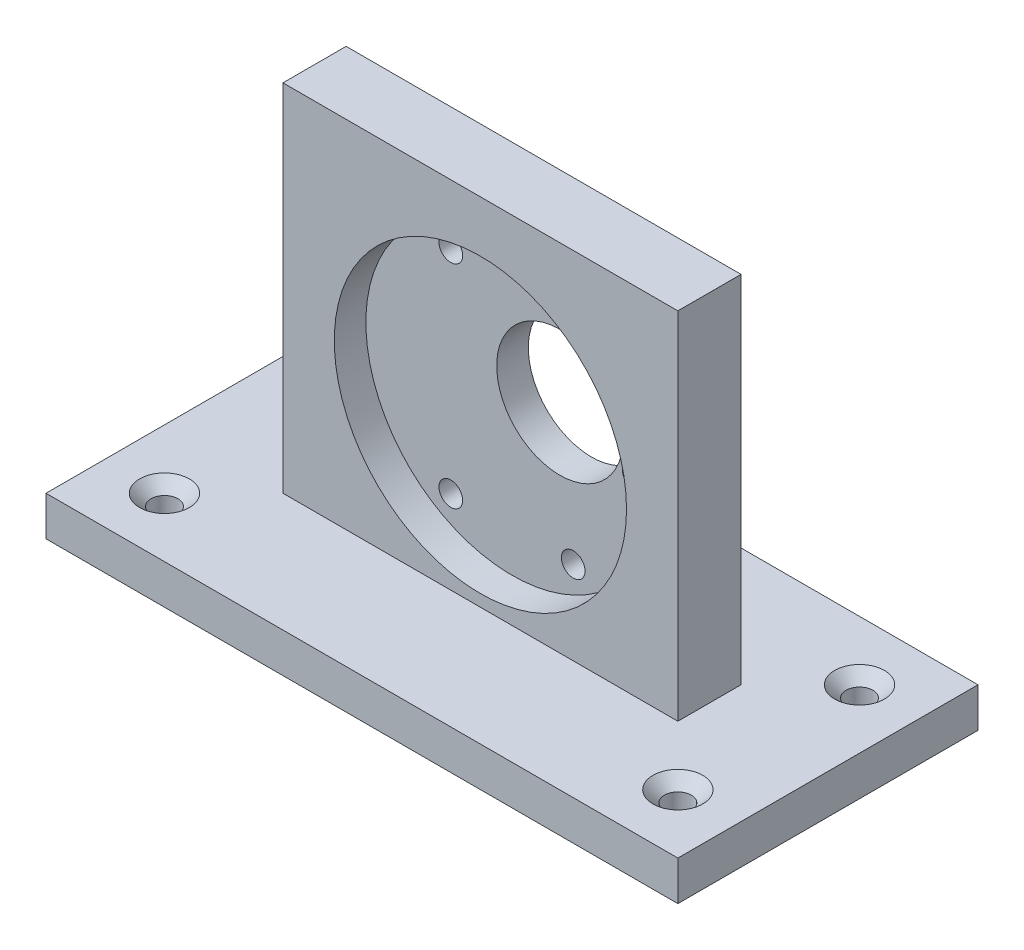
ISO-10303-21;
HEADER;
FILE_DESCRIPTION(('STEP AP214'),'2;1');
FILE_NAME('part.step','',(''),(''),'','','');
FILE_SCHEMA(('AUTOMOTIVE_DESIGN { 1 0 10303 214 1 1 1 1 }'));
ENDSEC;
DATA;
#1=APPLICATION_CONTEXT('core data for automotive mechanical design processes');
#2=APPLICATION_PROTOCOL_DEFINITION('international standard','automotive_design',2000,#1);
#3=PRODUCT_CONTEXT('',#1,'mechanical');
#4=PRODUCT('Part','Part','',(#3));
#5=PRODUCT_RELATED_PRODUCT_CATEGORY('part','',(#4));
#6=PRODUCT_DEFINITION_FORMATION('','',#4);
#7=PRODUCT_DEFINITION_CONTEXT('part definition',#1,'design');
#8=PRODUCT_DEFINITION('design','',#6,#7);
#9=PRODUCT_DEFINITION_SHAPE('','',#8);
#10=(LENGTH_UNIT() NAMED_UNIT(*) SI_UNIT(.MILLI.,.METRE.));
#11=(NAMED_UNIT(*) PLANE_ANGLE_UNIT() SI_UNIT($,.RADIAN.));
#12=(NAMED_UNIT(*) SI_UNIT($,.STERADIAN.) SOLID_ANGLE_UNIT());
#13=UNCERTAINTY_MEASURE_WITH_UNIT(LENGTH_MEASURE(1.E-05),#10,'distance_accuracy_value','');
#14=(GEOMETRIC_REPRESENTATION_CONTEXT(3) GLOBAL_UNCERTAINTY_ASSIGNED_CONTEXT((#13)) GLOBAL_UNIT_ASSIGNED_CONTEXT((#10,
#11,#12)) REPRESENTATION_CONTEXT('',''));
#15=CARTESIAN_POINT('',(0.,0.,0.));
#16=DIRECTION('',(0.,0.,1.));
#17=DIRECTION('',(1.,0.,0.));
#18=AXIS2_PLACEMENT_3D('',#15,#16,#17);
#19=CARTESIAN_POINT('',(-25.,50.,8.));
#20=DIRECTION('',(1.,0.,0.));
#21=DIRECTION('',(0.,1.,0.));
#22=AXIS2_PLACEMENT_3D('',#19,#20,#21);
#23=PLANE('',#22);
#24=DIRECTION('',(0.,0.,-1.));
#25=VECTOR('',#24,1.);
#26=CARTESIAN_POINT('',(-25.,5.,8.));
#27=LINE('',#26,#25);
#28=CARTESIAN_POINT('',(-25.,5.,8.));
#29=VERTEX_POINT('',#28);
#30=CARTESIAN_POINT('',(-25.,5.,0.));
#31=VERTEX_POINT('',#30);
#32=EDGE_CURVE('E60',#29,#31,#27,.T.);
#33=ORIENTED_EDGE('',*,*,#32,.F.);
#34=DIRECTION('',(0.,-1.,0.));
#35=VECTOR('',#34,1.);
#36=CARTESIAN_POINT('',(-25.,50.,8.));
#37=LINE('',#36,#35);
#38=CARTESIAN_POINT('',(-25.,50.,8.));
#39=VERTEX_POINT('',#38);
#40=EDGE_CURVE('E84',#39,#29,#37,.T.);
#41=ORIENTED_EDGE('',*,*,#40,.F.);
#42=DIRECTION('',(0.,0.,-1.));
#43=VECTOR('',#42,1.);
#44=CARTESIAN_POINT('',(-25.,50.,8.));
#45=LINE('',#44,#43);
#46=CARTESIAN_POINT('',(-25.,50.,0.));
#47=VERTEX_POINT('',#46);
#48=EDGE_CURVE('E69',#39,#47,#45,.T.);
#49=ORIENTED_EDGE('',*,*,#48,.T.);
#50=DIRECTION('',(0.,-1.,0.));
#51=VECTOR('',#50,1.);
#52=CARTESIAN_POINT('',(-25.,50.,0.));
#53=LINE('',#52,#51);
#54=EDGE_CURVE('E82',#47,#31,#53,.T.);
#55=ORIENTED_EDGE('',*,*,#54,.T.);
#56=EDGE_LOOP('',(#33,#41,#49,#55));
#57=FACE_BOUND('',#56,.T.);
#58=ADVANCED_FACE('F45',(#57),#23,.F.);
#59=CARTESIAN_POINT('',(25.,50.,8.));
#60=DIRECTION('',(1.,0.,0.));
#61=DIRECTION('',(0.,1.,0.));
#62=AXIS2_PLACEMENT_3D('',#59,#60,#61);
#63=PLANE('',#62);
#64=DIRECTION('',(0.,-1.,0.));
#65=VECTOR('',#64,1.);
#66=CARTESIAN_POINT('',(25.,50.,8.));
#67=LINE('',#66,#65);
#68=CARTESIAN_POINT('',(25.,50.,8.));
#69=VERTEX_POINT('',#68);
#70=CARTESIAN_POINT('',(25.,5.00000000000001,8.));
#71=VERTEX_POINT('',#70);
#72=EDGE_CURVE('E152',#69,#71,#67,.T.);
#73=ORIENTED_EDGE('',*,*,#72,.T.);
#74=DIRECTION('',(0.,0.,-1.));
#75=VECTOR('',#74,1.);
#76=CARTESIAN_POINT('',(25.,5.00000000000001,8.));
#77=LINE('',#76,#75);
#78=CARTESIAN_POINT('',(25.,5.00000000000001,0.));
#79=VERTEX_POINT('',#78);
#80=EDGE_CURVE('E202',#71,#79,#77,.T.);
#81=ORIENTED_EDGE('',*,*,#80,.T.);
#82=DIRECTION('',(0.,-1.,0.));
#83=VECTOR('',#82,1.);
#84=CARTESIAN_POINT('',(25.,50.,0.));
#85=LINE('',#84,#83);
#86=CARTESIAN_POINT('',(25.,50.,0.));
#87=VERTEX_POINT('',#86);
#88=EDGE_CURVE('E94',#87,#79,#85,.T.);
#89=ORIENTED_EDGE('',*,*,#88,.F.);
#90=DIRECTION('',(0.,0.,-1.));
#91=VECTOR('',#90,1.);
#92=CARTESIAN_POINT('',(25.,50.,8.));
#93=LINE('',#92,#91);
#94=EDGE_CURVE('E86',#69,#87,#93,.T.);
#95=ORIENTED_EDGE('',*,*,#94,.F.);
#96=EDGE_LOOP('',(#73,#81,#89,#95));
#97=FACE_BOUND('',#96,.T.);
#98=ADVANCED_FACE('F239',(#97),#63,.T.);
#99=CARTESIAN_POINT('',(0.,0.,8.));
#100=DIRECTION('',(0.,0.,-1.));
#101=DIRECTION('',(-1.,0.,0.));
#102=AXIS2_PLACEMENT_3D('',#99,#100,#101);
#103=PLANE('',#102);
#104=CARTESIAN_POINT('',(0.,25.,8.));
#105=DIRECTION('',(0.,0.,1.));
#106=DIRECTION('',(1.,0.,0.));
#107=AXIS2_PLACEMENT_3D('',#104,#105,#106);
#108=CIRCLE('',#107,18.5);
#109=CARTESIAN_POINT('',(18.5,25.,8.));
#110=VERTEX_POINT('',#109);
#111=EDGE_CURVE('E117',#110,#110,#108,.T.);
#112=ORIENTED_EDGE('',*,*,#111,.F.);
#113=EDGE_LOOP('',(#112));
#114=FACE_BOUND('',#113,.T.);
#115=DIRECTION('',(-1.,0.,0.));
#116=VECTOR('',#115,1.);
#117=CARTESIAN_POINT('',(0.,5.00000000000001,8.));
#118=LINE('',#117,#116);
#119=EDGE_CURVE('E122',#71,#29,#118,.T.);
#120=ORIENTED_EDGE('',*,*,#119,.F.);
#121=ORIENTED_EDGE('',*,*,#72,.F.);
#122=DIRECTION('',(1.,0.,0.));
#123=VECTOR('',#122,1.);
#124=CARTESIAN_POINT('',(-25.,50.,8.));
#125=LINE('',#124,#123);
#126=EDGE_CURVE('E93',#39,#69,#125,.T.);
#127=ORIENTED_EDGE('',*,*,#126,.F.);
#128=ORIENTED_EDGE('',*,*,#40,.T.);
#129=EDGE_LOOP('',(#120,#121,#127,#128));
#130=FACE_BOUND('',#129,.T.);
#131=ADVANCED_FACE('F160',(#114,#130),#103,.F.);
#132=CARTESIAN_POINT('',(0.,0.,0.));
#133=DIRECTION('',(0.,0.,-1.));
#134=DIRECTION('',(-1.,0.,0.));
#135=AXIS2_PLACEMENT_3D('',#132,#133,#134);
#136=PLANE('',#135);
#137=CARTESIAN_POINT('',(-17.9178221746704,28.4999999993294,0.));
#138=DIRECTION('',(0.,0.,-1.));
#139=DIRECTION('',(-1.,0.,0.));
#140=AXIS2_PLACEMENT_3D('',#137,#138,#139);
#141=CIRCLE('',#140,6.207);
#142=CARTESIAN_POINT('',(-24.1248221746704,28.4999999993294,0.));
#143=VERTEX_POINT('',#142);
#144=EDGE_CURVE('E321',#143,#143,#141,.T.);
#145=ORIENTED_EDGE('',*,*,#144,.F.);
#146=EDGE_LOOP('',(#145));
#147=FACE_BOUND('',#146,.T.);
#148=CARTESIAN_POINT('',(-7.74999999999999,38.4233937586588,0.));
#149=DIRECTION('',(0.,0.,1.));
#150=DIRECTION('',(1.,0.,0.));
#151=AXIS2_PLACEMENT_3D('',#148,#149,#150);
#152=CIRCLE('',#151,1.50000000039213);
#153=CARTESIAN_POINT('',(-6.24999999960786,38.4233937586588,0.));
#154=VERTEX_POINT('',#153);
#155=EDGE_CURVE('E101',#154,#154,#152,.T.);
#156=ORIENTED_EDGE('',*,*,#155,.T.);
#157=EDGE_LOOP('',(#156));
#158=FACE_BOUND('',#157,.T.);
#159=CARTESIAN_POINT('',(-7.74999999999999,11.5766062413412,0.));
#160=DIRECTION('',(0.,0.,1.));
#161=DIRECTION('',(1.,0.,0.));
#162=AXIS2_PLACEMENT_3D('',#159,#160,#161);
#163=CIRCLE('',#162,1.50000000039213);
#164=CARTESIAN_POINT('',(-6.24999999960786,11.5766062413412,0.));
#165=VERTEX_POINT('',#164);
#166=EDGE_CURVE('E144',#165,#165,#163,.T.);
#167=ORIENTED_EDGE('',*,*,#166,.T.);
#168=EDGE_LOOP('',(#167));
#169=FACE_BOUND('',#168,.T.);
#170=CARTESIAN_POINT('',(7.75000000000001,11.5766062413412,0.));
#171=DIRECTION('',(0.,0.,1.));
#172=DIRECTION('',(1.,0.,0.));
#173=AXIS2_PLACEMENT_3D('',#170,#171,#172);
#174=CIRCLE('',#173,1.50000000039213);
#175=CARTESIAN_POINT('',(9.25000000039214,11.5766062413412,0.));
#176=VERTEX_POINT('',#175);
#177=EDGE_CURVE('E147',#176,#176,#174,.T.);
#178=ORIENTED_EDGE('',*,*,#177,.T.);
#179=EDGE_LOOP('',(#178));
#180=FACE_BOUND('',#179,.T.);
#181=CARTESIAN_POINT('',(15.5,25.,0.));
#182=DIRECTION('',(0.,0.,1.));
#183=DIRECTION('',(1.,0.,0.));
#184=AXIS2_PLACEMENT_3D('',#181,#182,#183);
#185=CIRCLE('',#184,1.50000000039213);
#186=CARTESIAN_POINT('',(17.0000000003921,25.,0.));
#187=VERTEX_POINT('',#186);
#188=EDGE_CURVE('E141',#187,#187,#185,.T.);
#189=ORIENTED_EDGE('',*,*,#188,.T.);
#190=EDGE_LOOP('',(#189));
#191=FACE_BOUND('',#190,.T.);
#192=CARTESIAN_POINT('',(6.06217782532956,28.4999999993294,0.));
#193=DIRECTION('',(0.,0.,1.));
#194=DIRECTION('',(1.,0.,0.));
#195=AXIS2_PLACEMENT_3D('',#192,#193,#194);
#196=CIRCLE('',#195,8.00000000000001);
#197=CARTESIAN_POINT('',(14.0621778253296,28.4999999993294,0.));
#198=VERTEX_POINT('',#197);
#199=EDGE_CURVE('E138',#198,#198,#196,.T.);
#200=ORIENTED_EDGE('',*,*,#199,.T.);
#201=EDGE_LOOP('',(#200));
#202=FACE_BOUND('',#201,.T.);
#203=CARTESIAN_POINT('',(7.74999999999999,38.4233937586588,0.));
#204=DIRECTION('',(0.,0.,1.));
#205=DIRECTION('',(1.,0.,0.));
#206=AXIS2_PLACEMENT_3D('',#203,#204,#205);
#207=CIRCLE('',#206,1.50000000039214);
#208=CARTESIAN_POINT('',(9.25000000039213,38.4233937586588,0.));
#209=VERTEX_POINT('',#208);
#210=EDGE_CURVE('E97',#209,#209,#207,.T.);
#211=ORIENTED_EDGE('',*,*,#210,.T.);
#212=EDGE_LOOP('',(#211));
#213=FACE_BOUND('',#212,.T.);
#214=ORIENTED_EDGE('',*,*,#88,.T.);
#215=DIRECTION('',(-1.,0.,0.));
#216=VECTOR('',#215,1.);
#217=CARTESIAN_POINT('',(0.,5.00000000000001,0.));
#218=LINE('',#217,#216);
#219=EDGE_CURVE('E53',#79,#31,#218,.T.);
#220=ORIENTED_EDGE('',*,*,#219,.T.);
#221=ORIENTED_EDGE('',*,*,#54,.F.);
#222=DIRECTION('',(1.,0.,0.));
#223=VECTOR('',#222,1.);
#224=CARTESIAN_POINT('',(-25.,50.,0.));
#225=LINE('',#224,#223);
#226=EDGE_CURVE('E92',#47,#87,#225,.T.);
#227=ORIENTED_EDGE('',*,*,#226,.T.);
#228=EDGE_LOOP('',(#214,#220,#221,#227));
#229=FACE_BOUND('',#228,.T.);
#230=ADVANCED_FACE('F91',(#147,#158,#169,#180,#191,#202,#213,#229),#136,.T.);
#231=CARTESIAN_POINT('',(7.74999999999999,38.4233937586588,10.));
#232=DIRECTION('',(0.,0.,-1.));
#233=DIRECTION('',(-1.,0.,0.));
#234=AXIS2_PLACEMENT_3D('',#231,#232,#233);
#235=CYLINDRICAL_SURFACE('',#234,1.50000000039214);
#236=ORIENTED_EDGE('',*,*,#210,.F.);
#237=EDGE_LOOP('',(#236));
#238=FACE_BOUND('',#237,.T.);
#239=CARTESIAN_POINT('',(7.74999999999999,38.4233937586588,4.));
#240=DIRECTION('',(0.,0.,1.));
#241=DIRECTION('',(1.,0.,0.));
#242=AXIS2_PLACEMENT_3D('',#239,#240,#241);
#243=CIRCLE('',#242,1.50000000039214);
#244=CARTESIAN_POINT('',(9.25000000039213,38.4233937586588,4.));
#245=VERTEX_POINT('',#244);
#246=EDGE_CURVE('E135',#245,#245,#243,.T.);
#247=ORIENTED_EDGE('',*,*,#246,.T.);
#248=EDGE_LOOP('',(#247));
#249=FACE_BOUND('',#248,.T.);
#250=ADVANCED_FACE('F390',(#238,#249),#235,.F.);
#251=CARTESIAN_POINT('',(6.06217782532956,28.4999999993294,10.));
#252=DIRECTION('',(0.,0.,-1.));
#253=DIRECTION('',(-1.,0.,0.));
#254=AXIS2_PLACEMENT_3D('',#251,#252,#253);
#255=CYLINDRICAL_SURFACE('',#254,8.00000000000001);
#256=ORIENTED_EDGE('',*,*,#199,.F.);
#257=EDGE_LOOP('',(#256));
#258=FACE_BOUND('',#257,.T.);
#259=CARTESIAN_POINT('',(6.06217782532956,28.4999999993294,4.));
#260=DIRECTION('',(0.,0.,1.));
#261=DIRECTION('',(1.,0.,0.));
#262=AXIS2_PLACEMENT_3D('',#259,#260,#261);
#263=CIRCLE('',#262,8.00000000000001);
#264=CARTESIAN_POINT('',(14.0621778253296,28.4999999993294,4.));
#265=VERTEX_POINT('',#264);
#266=EDGE_CURVE('E132',#265,#265,#263,.T.);
#267=ORIENTED_EDGE('',*,*,#266,.T.);
#268=EDGE_LOOP('',(#267));
#269=FACE_BOUND('',#268,.T.);
#270=ADVANCED_FACE('F386',(#258,#269),#255,.F.);
#271=CARTESIAN_POINT('',(15.5,25.,10.));
#272=DIRECTION('',(0.,0.,-1.));
#273=DIRECTION('',(-1.,0.,0.));
#274=AXIS2_PLACEMENT_3D('',#271,#272,#273);
#275=CYLINDRICAL_SURFACE('',#274,1.50000000039213);
#276=ORIENTED_EDGE('',*,*,#188,.F.);
#277=EDGE_LOOP('',(#276));
#278=FACE_BOUND('',#277,.T.);
#279=CARTESIAN_POINT('',(15.5,25.,4.));
#280=DIRECTION('',(0.,0.,1.));
#281=DIRECTION('',(1.,0.,0.));
#282=AXIS2_PLACEMENT_3D('',#279,#280,#281);
#283=CIRCLE('',#282,1.50000000039213);
#284=CARTESIAN_POINT('',(17.0000000003921,25.,4.));
#285=VERTEX_POINT('',#284);
#286=EDGE_CURVE('E129',#285,#285,#283,.T.);
#287=ORIENTED_EDGE('',*,*,#286,.T.);
#288=EDGE_LOOP('',(#287));
#289=FACE_BOUND('',#288,.T.);
#290=ADVANCED_FACE('F389',(#278,#289),#275,.F.);
#291=CARTESIAN_POINT('',(7.75000000000001,11.5766062413412,10.));
#292=DIRECTION('',(0.,0.,-1.));
#293=DIRECTION('',(-1.,0.,0.));
#294=AXIS2_PLACEMENT_3D('',#291,#292,#293);
#295=CYLINDRICAL_SURFACE('',#294,1.50000000039213);
#296=ORIENTED_EDGE('',*,*,#177,.F.);
#297=EDGE_LOOP('',(#296));
#298=FACE_BOUND('',#297,.T.);
#299=CARTESIAN_POINT('',(7.75000000000001,11.5766062413412,4.));
#300=DIRECTION('',(0.,0.,1.));
#301=DIRECTION('',(1.,0.,0.));
#302=AXIS2_PLACEMENT_3D('',#299,#300,#301);
#303=CIRCLE('',#302,1.50000000039213);
#304=CARTESIAN_POINT('',(9.25000000039214,11.5766062413412,4.));
#305=VERTEX_POINT('',#304);
#306=EDGE_CURVE('E114',#305,#305,#303,.T.);
#307=ORIENTED_EDGE('',*,*,#306,.T.);
#308=EDGE_LOOP('',(#307));
#309=FACE_BOUND('',#308,.T.);
#310=ADVANCED_FACE('F399',(#298,#309),#295,.F.);
#311=CARTESIAN_POINT('',(-7.74999999999999,11.5766062413412,10.));
#312=DIRECTION('',(0.,0.,-1.));
#313=DIRECTION('',(-1.,0.,0.));
#314=AXIS2_PLACEMENT_3D('',#311,#312,#313);
#315=CYLINDRICAL_SURFACE('',#314,1.50000000039213);
#316=ORIENTED_EDGE('',*,*,#166,.F.);
#317=EDGE_LOOP('',(#316));
#318=FACE_BOUND('',#317,.T.);
#319=CARTESIAN_POINT('',(-7.74999999999999,11.5766062413412,4.));
#320=DIRECTION('',(0.,0.,1.));
#321=DIRECTION('',(1.,0.,0.));
#322=AXIS2_PLACEMENT_3D('',#319,#320,#321);
#323=CIRCLE('',#322,1.50000000039213);
#324=CARTESIAN_POINT('',(-6.24999999960786,11.5766062413412,4.));
#325=VERTEX_POINT('',#324);
#326=EDGE_CURVE('E109',#325,#325,#323,.T.);
#327=ORIENTED_EDGE('',*,*,#326,.T.);
#328=EDGE_LOOP('',(#327));
#329=FACE_BOUND('',#328,.T.);
#330=ADVANCED_FACE('F395',(#318,#329),#315,.F.);
#331=CARTESIAN_POINT('',(-7.74999999999999,38.4233937586588,10.));
#332=DIRECTION('',(0.,0.,-1.));
#333=DIRECTION('',(-1.,0.,0.));
#334=AXIS2_PLACEMENT_3D('',#331,#332,#333);
#335=CYLINDRICAL_SURFACE('',#334,1.50000000039213);
#336=ORIENTED_EDGE('',*,*,#155,.F.);
#337=EDGE_LOOP('',(#336));
#338=FACE_BOUND('',#337,.T.);
#339=CARTESIAN_POINT('',(-7.74999999999999,38.4233937586588,4.));
#340=DIRECTION('',(0.,0.,1.));
#341=DIRECTION('',(1.,0.,0.));
#342=AXIS2_PLACEMENT_3D('',#339,#340,#341);
#343=CIRCLE('',#342,1.50000000039213);
#344=CARTESIAN_POINT('',(-6.24999999960786,38.4233937586588,4.));
#345=VERTEX_POINT('',#344);
#346=EDGE_CURVE('E107',#345,#345,#343,.T.);
#347=ORIENTED_EDGE('',*,*,#346,.T.);
#348=EDGE_LOOP('',(#347));
#349=FACE_BOUND('',#348,.T.);
#350=ADVANCED_FACE('F392',(#338,#349),#335,.F.);
#351=CARTESIAN_POINT('',(-25.,50.,8.));
#352=DIRECTION('',(0.,1.,0.));
#353=DIRECTION('',(-1.,0.,0.));
#354=AXIS2_PLACEMENT_3D('',#351,#352,#353);
#355=PLANE('',#354);
#356=ORIENTED_EDGE('',*,*,#226,.F.);
#357=ORIENTED_EDGE('',*,*,#48,.F.);
#358=ORIENTED_EDGE('',*,*,#126,.T.);
#359=ORIENTED_EDGE('',*,*,#94,.T.);
#360=EDGE_LOOP('',(#356,#357,#358,#359));
#361=FACE_BOUND('',#360,.T.);
#362=ADVANCED_FACE('F47',(#361),#355,.T.);
#363=CARTESIAN_POINT('',(0.,25.,4.));
#364=DIRECTION('',(0.,0.,1.));
#365=DIRECTION('',(1.,0.,0.));
#366=AXIS2_PLACEMENT_3D('',#363,#364,#365);
#367=CYLINDRICAL_SURFACE('',#366,18.5);
#368=CARTESIAN_POINT('',(0.,25.,4.));
#369=DIRECTION('',(0.,0.,1.));
#370=DIRECTION('',(1.,0.,0.));
#371=AXIS2_PLACEMENT_3D('',#368,#369,#370);
#372=CIRCLE('',#371,18.5);
#373=CARTESIAN_POINT('',(18.5,25.,4.));
#374=VERTEX_POINT('',#373);
#375=EDGE_CURVE('E110',#374,#374,#372,.T.);
#376=ORIENTED_EDGE('',*,*,#375,.F.);
#377=EDGE_LOOP('',(#376));
#378=FACE_BOUND('',#377,.T.);
#379=ORIENTED_EDGE('',*,*,#111,.T.);
#380=EDGE_LOOP('',(#379));
#381=FACE_BOUND('',#380,.T.);
#382=ADVANCED_FACE('F251',(#378,#381),#367,.F.);
#383=CARTESIAN_POINT('',(0.,25.,4.));
#384=DIRECTION('',(0.,0.,1.));
#385=DIRECTION('',(1.,0.,0.));
#386=AXIS2_PLACEMENT_3D('',#383,#384,#385);
#387=PLANE('',#386);
#388=ORIENTED_EDGE('',*,*,#246,.F.);
#389=EDGE_LOOP('',(#388));
#390=FACE_BOUND('',#389,.T.);
#391=ORIENTED_EDGE('',*,*,#266,.F.);
#392=EDGE_LOOP('',(#391));
#393=FACE_BOUND('',#392,.T.);
#394=ORIENTED_EDGE('',*,*,#286,.F.);
#395=EDGE_LOOP('',(#394));
#396=FACE_BOUND('',#395,.T.);
#397=ORIENTED_EDGE('',*,*,#306,.F.);
#398=EDGE_LOOP('',(#397));
#399=FACE_BOUND('',#398,.T.);
#400=ORIENTED_EDGE('',*,*,#326,.F.);
#401=EDGE_LOOP('',(#400));
#402=FACE_BOUND('',#401,.T.);
#403=ORIENTED_EDGE('',*,*,#346,.F.);
#404=EDGE_LOOP('',(#403));
#405=FACE_BOUND('',#404,.T.);
#406=ORIENTED_EDGE('',*,*,#375,.T.);
#407=EDGE_LOOP('',(#406));
#408=FACE_BOUND('',#407,.T.);
#409=ADVANCED_FACE('F242',(#390,#393,#396,#399,#402,#405,#408),#387,.T.);
#410=CARTESIAN_POINT('',(-40.,5.,23.));
#411=DIRECTION('',(0.,-1.,0.));
#412=DIRECTION('',(1.,0.,0.));
#413=AXIS2_PLACEMENT_3D('',#410,#411,#412);
#414=PLANE('',#413);
#415=CARTESIAN_POINT('',(-32.5,5.,-7.5));
#416=DIRECTION('',(0.,1.,0.));
#417=DIRECTION('',(0.,0.,1.));
#418=AXIS2_PLACEMENT_3D('',#415,#416,#417);
#419=CIRCLE('',#418,3.15);
#420=CARTESIAN_POINT('',(-32.5,5.,-4.35));
#421=VERTEX_POINT('',#420);
#422=EDGE_CURVE('E317',#421,#421,#419,.T.);
#423=ORIENTED_EDGE('',*,*,#422,.F.);
#424=EDGE_LOOP('',(#423));
#425=FACE_BOUND('',#424,.T.);
#426=CARTESIAN_POINT('',(-32.5,5.,15.5));
#427=DIRECTION('',(0.,1.,0.));
#428=DIRECTION('',(0.,0.,1.));
#429=AXIS2_PLACEMENT_3D('',#426,#427,#428);
#430=CIRCLE('',#429,3.15);
#431=CARTESIAN_POINT('',(-32.5,5.,18.65));
#432=VERTEX_POINT('',#431);
#433=EDGE_CURVE('E310',#432,#432,#430,.T.);
#434=ORIENTED_EDGE('',*,*,#433,.F.);
#435=EDGE_LOOP('',(#434));
#436=FACE_BOUND('',#435,.T.);
#437=CARTESIAN_POINT('',(32.5,5.00000000000002,15.5));
#438=DIRECTION('',(0.,1.,0.));
#439=DIRECTION('',(0.,0.,1.));
#440=AXIS2_PLACEMENT_3D('',#437,#438,#439);
#441=CIRCLE('',#440,3.15);
#442=CARTESIAN_POINT('',(32.5,5.00000000000002,18.65));
#443=VERTEX_POINT('',#442);
#444=EDGE_CURVE('E303',#443,#443,#441,.T.);
#445=ORIENTED_EDGE('',*,*,#444,.F.);
#446=EDGE_LOOP('',(#445));
#447=FACE_BOUND('',#446,.T.);
#448=CARTESIAN_POINT('',(32.5,5.00000000000002,-7.5));
#449=DIRECTION('',(0.,1.,0.));
#450=DIRECTION('',(0.,0.,1.));
#451=AXIS2_PLACEMENT_3D('',#448,#449,#450);
#452=CIRCLE('',#451,3.15);
#453=CARTESIAN_POINT('',(32.5,5.00000000000002,-4.35));
#454=VERTEX_POINT('',#453);
#455=EDGE_CURVE('E295',#454,#454,#452,.T.);
#456=ORIENTED_EDGE('',*,*,#455,.F.);
#457=EDGE_LOOP('',(#456));
#458=FACE_BOUND('',#457,.T.);
#459=DIRECTION('',(0.,0.,-1.));
#460=VECTOR('',#459,1.);
#461=CARTESIAN_POINT('',(40.,5.00000000000002,23.));
#462=LINE('',#461,#460);
#463=CARTESIAN_POINT('',(40.,5.00000000000002,23.));
#464=VERTEX_POINT('',#463);
#465=CARTESIAN_POINT('',(40.,5.00000000000002,-15.));
#466=VERTEX_POINT('',#465);
#467=EDGE_CURVE('E236',#464,#466,#462,.T.);
#468=ORIENTED_EDGE('',*,*,#467,.T.);
#469=DIRECTION('',(-1.,0.,0.));
#470=VECTOR('',#469,1.);
#471=CARTESIAN_POINT('',(-40.,5.,-15.));
#472=LINE('',#471,#470);
#473=CARTESIAN_POINT('',(-40.,5.,-15.));
#474=VERTEX_POINT('',#473);
#475=EDGE_CURVE('E226',#466,#474,#472,.T.);
#476=ORIENTED_EDGE('',*,*,#475,.T.);
#477=DIRECTION('',(0.,0.,-1.));
#478=VECTOR('',#477,1.);
#479=CARTESIAN_POINT('',(-40.,5.,23.));
#480=LINE('',#479,#478);
#481=CARTESIAN_POINT('',(-40.,5.,23.));
#482=VERTEX_POINT('',#481);
#483=EDGE_CURVE('E217',#482,#474,#480,.T.);
#484=ORIENTED_EDGE('',*,*,#483,.F.);
#485=DIRECTION('',(-1.,0.,0.));
#486=VECTOR('',#485,1.);
#487=CARTESIAN_POINT('',(-40.,5.,23.));
#488=LINE('',#487,#486);
#489=EDGE_CURVE('E233',#464,#482,#488,.T.);
#490=ORIENTED_EDGE('',*,*,#489,.F.);
#491=EDGE_LOOP('',(#468,#476,#484,#490));
#492=FACE_BOUND('',#491,.T.);
#493=ORIENTED_EDGE('',*,*,#80,.F.);
#494=ORIENTED_EDGE('',*,*,#119,.T.);
#495=ORIENTED_EDGE('',*,*,#32,.T.);
#496=ORIENTED_EDGE('',*,*,#219,.F.);
#497=EDGE_LOOP('',(#493,#494,#495,#496));
#498=FACE_BOUND('',#497,.T.);
#499=ADVANCED_FACE('F240',(#425,#436,#447,#458,#492,#498),#414,.F.);
#500=CARTESIAN_POINT('',(-40.,5.,23.));
#501=DIRECTION('',(1.,0.,0.));
#502=DIRECTION('',(0.,0.,-1.));
#503=AXIS2_PLACEMENT_3D('',#500,#501,#502);
#504=PLANE('',#503);
#505=ORIENTED_EDGE('',*,*,#483,.T.);
#506=DIRECTION('',(0.,-1.,0.));
#507=VECTOR('',#506,1.);
#508=CARTESIAN_POINT('',(-40.,5.,-15.));
#509=LINE('',#508,#507);
#510=CARTESIAN_POINT('',(-40.,0.,-15.));
#511=VERTEX_POINT('',#510);
#512=EDGE_CURVE('E210',#474,#511,#509,.T.);
#513=ORIENTED_EDGE('',*,*,#512,.T.);
#514=DIRECTION('',(0.,0.,-1.));
#515=VECTOR('',#514,1.);
#516=CARTESIAN_POINT('',(-40.,0.,23.));
#517=LINE('',#516,#515);
#518=CARTESIAN_POINT('',(-40.,0.,23.));
#519=VERTEX_POINT('',#518);
#520=EDGE_CURVE('E192',#519,#511,#517,.T.);
#521=ORIENTED_EDGE('',*,*,#520,.F.);
#522=DIRECTION('',(0.,-1.,0.));
#523=VECTOR('',#522,1.);
#524=CARTESIAN_POINT('',(-40.,5.,23.));
#525=LINE('',#524,#523);
#526=EDGE_CURVE('E228',#482,#519,#525,.T.);
#527=ORIENTED_EDGE('',*,*,#526,.F.);
#528=EDGE_LOOP('',(#505,#513,#521,#527));
#529=FACE_BOUND('',#528,.T.);
#530=ADVANCED_FACE('F215',(#529),#504,.F.);
#531=CARTESIAN_POINT('',(40.,5.00000000000002,23.));
#532=DIRECTION('',(-1.,0.,0.));
#533=DIRECTION('',(0.,0.,1.));
#534=AXIS2_PLACEMENT_3D('',#531,#532,#533);
#535=PLANE('',#534);
#536=DIRECTION('',(0.,0.,-1.));
#537=VECTOR('',#536,1.);
#538=CARTESIAN_POINT('',(40.,0.,23.));
#539=LINE('',#538,#537);
#540=CARTESIAN_POINT('',(40.,0.,23.));
#541=VERTEX_POINT('',#540);
#542=CARTESIAN_POINT('',(40.,0.,-15.));
#543=VERTEX_POINT('',#542);
#544=EDGE_CURVE('E203',#541,#543,#539,.T.);
#545=ORIENTED_EDGE('',*,*,#544,.T.);
#546=DIRECTION('',(0.,1.,0.));
#547=VECTOR('',#546,1.);
#548=CARTESIAN_POINT('',(40.,5.00000000000002,-15.));
#549=LINE('',#548,#547);
#550=EDGE_CURVE('E213',#543,#466,#549,.T.);
#551=ORIENTED_EDGE('',*,*,#550,.T.);
#552=ORIENTED_EDGE('',*,*,#467,.F.);
#553=DIRECTION('',(0.,1.,0.));
#554=VECTOR('',#553,1.);
#555=CARTESIAN_POINT('',(40.,5.00000000000002,23.));
#556=LINE('',#555,#554);
#557=EDGE_CURVE('E231',#541,#464,#556,.T.);
#558=ORIENTED_EDGE('',*,*,#557,.F.);
#559=EDGE_LOOP('',(#545,#551,#552,#558));
#560=FACE_BOUND('',#559,.T.);
#561=ADVANCED_FACE('F249',(#560),#535,.F.);
#562=CARTESIAN_POINT('',(0.,0.,23.));
#563=DIRECTION('',(0.,0.,1.));
#564=DIRECTION('',(1.,0.,0.));
#565=AXIS2_PLACEMENT_3D('',#562,#563,#564);
#566=PLANE('',#565);
#567=ORIENTED_EDGE('',*,*,#526,.T.);
#568=DIRECTION('',(1.,0.,0.));
#569=VECTOR('',#568,1.);
#570=CARTESIAN_POINT('',(-40.,0.,23.));
#571=LINE('',#570,#569);
#572=EDGE_CURVE('E197',#519,#541,#571,.T.);
#573=ORIENTED_EDGE('',*,*,#572,.T.);
#574=ORIENTED_EDGE('',*,*,#557,.T.);
#575=ORIENTED_EDGE('',*,*,#489,.T.);
#576=EDGE_LOOP('',(#567,#573,#574,#575));
#577=FACE_BOUND('',#576,.T.);
#578=ADVANCED_FACE('F276',(#577),#566,.T.);
#579=CARTESIAN_POINT('',(0.,0.,-15.));
#580=DIRECTION('',(0.,0.,1.));
#581=DIRECTION('',(1.,0.,0.));
#582=AXIS2_PLACEMENT_3D('',#579,#580,#581);
#583=PLANE('',#582);
#584=ORIENTED_EDGE('',*,*,#512,.F.);
#585=ORIENTED_EDGE('',*,*,#475,.F.);
#586=ORIENTED_EDGE('',*,*,#550,.F.);
#587=DIRECTION('',(1.,0.,0.));
#588=VECTOR('',#587,1.);
#589=CARTESIAN_POINT('',(-40.,0.,-15.));
#590=LINE('',#589,#588);
#591=EDGE_CURVE('E196',#511,#543,#590,.T.);
#592=ORIENTED_EDGE('',*,*,#591,.F.);
#593=EDGE_LOOP('',(#584,#585,#586,#592));
#594=FACE_BOUND('',#593,.T.);
#595=ADVANCED_FACE('F208',(#594),#583,.F.);
#596=CARTESIAN_POINT('',(-25.,0.,8.));
#597=DIRECTION('',(0.,1.,0.));
#598=DIRECTION('',(-1.,0.,0.));
#599=AXIS2_PLACEMENT_3D('',#596,#597,#598);
#600=PLANE('',#599);
#601=CARTESIAN_POINT('',(-32.5,0.,-7.5));
#602=DIRECTION('',(0.,1.,0.));
#603=DIRECTION('',(0.,0.,1.));
#604=AXIS2_PLACEMENT_3D('',#601,#602,#603);
#605=CIRCLE('',#604,1.69999999999999);
#606=CARTESIAN_POINT('',(-32.5,0.,-5.80000000000001));
#607=VERTEX_POINT('',#606);
#608=EDGE_CURVE('E281',#607,#607,#605,.T.);
#609=ORIENTED_EDGE('',*,*,#608,.T.);
#610=EDGE_LOOP('',(#609));
#611=FACE_BOUND('',#610,.T.);
#612=CARTESIAN_POINT('',(-32.5,0.,15.5));
#613=DIRECTION('',(0.,1.,0.));
#614=DIRECTION('',(0.,0.,1.));
#615=AXIS2_PLACEMENT_3D('',#612,#613,#614);
#616=CIRCLE('',#615,1.69999999999999);
#617=CARTESIAN_POINT('',(-32.5,0.,17.2));
#618=VERTEX_POINT('',#617);
#619=EDGE_CURVE('E285',#618,#618,#616,.T.);
#620=ORIENTED_EDGE('',*,*,#619,.T.);
#621=EDGE_LOOP('',(#620));
#622=FACE_BOUND('',#621,.T.);
#623=CARTESIAN_POINT('',(32.5,0.,15.5));
#624=DIRECTION('',(0.,1.,0.));
#625=DIRECTION('',(0.,0.,1.));
#626=AXIS2_PLACEMENT_3D('',#623,#624,#625);
#627=CIRCLE('',#626,1.69999999999999);
#628=CARTESIAN_POINT('',(32.5,0.,17.2));
#629=VERTEX_POINT('',#628);
#630=EDGE_CURVE('E289',#629,#629,#627,.T.);
#631=ORIENTED_EDGE('',*,*,#630,.T.);
#632=EDGE_LOOP('',(#631));
#633=FACE_BOUND('',#632,.T.);
#634=CARTESIAN_POINT('',(32.5,0.,-7.5));
#635=DIRECTION('',(0.,1.,0.));
#636=DIRECTION('',(0.,0.,1.));
#637=AXIS2_PLACEMENT_3D('',#634,#635,#636);
#638=CIRCLE('',#637,1.69999999999999);
#639=CARTESIAN_POINT('',(32.5,0.,-5.80000000000001));
#640=VERTEX_POINT('',#639);
#641=EDGE_CURVE('E218',#640,#640,#638,.T.);
#642=ORIENTED_EDGE('',*,*,#641,.T.);
#643=EDGE_LOOP('',(#642));
#644=FACE_BOUND('',#643,.T.);
#645=ORIENTED_EDGE('',*,*,#520,.T.);
#646=ORIENTED_EDGE('',*,*,#591,.T.);
#647=ORIENTED_EDGE('',*,*,#544,.F.);
#648=ORIENTED_EDGE('',*,*,#572,.F.);
#649=EDGE_LOOP('',(#645,#646,#647,#648));
#650=FACE_BOUND('',#649,.T.);
#651=ADVANCED_FACE('F194',(#611,#622,#633,#644,#650),#600,.F.);
#652=CARTESIAN_POINT('',(32.5,5.00000000000001,-7.5));
#653=DIRECTION('',(0.,1.,0.));
#654=DIRECTION('',(0.,0.,1.));
#655=AXIS2_PLACEMENT_3D('',#652,#653,#654);
#656=CYLINDRICAL_SURFACE('',#655,1.69999999999999);
#657=ORIENTED_EDGE('',*,*,#641,.F.);
#658=EDGE_LOOP('',(#657));
#659=FACE_BOUND('',#658,.T.);
#660=CARTESIAN_POINT('',(32.5,3.55000000000001,-7.5));
#661=DIRECTION('',(0.,1.,0.));
#662=DIRECTION('',(0.,0.,1.));
#663=AXIS2_PLACEMENT_3D('',#660,#661,#662);
#664=CIRCLE('',#663,1.69999999999999);
#665=CARTESIAN_POINT('',(32.5,3.55000000000001,-5.80000000000001));
#666=VERTEX_POINT('',#665);
#667=EDGE_CURVE('E221',#666,#666,#664,.T.);
#668=ORIENTED_EDGE('',*,*,#667,.T.);
#669=EDGE_LOOP('',(#668));
#670=FACE_BOUND('',#669,.T.);
#671=ADVANCED_FACE('F267',(#659,#670),#656,.F.);
#672=CARTESIAN_POINT('',(32.5,5.00000000000002,-7.5));
#673=DIRECTION('',(0.,1.,0.));
#674=DIRECTION('',(0.,0.,1.));
#675=AXIS2_PLACEMENT_3D('',#672,#673,#674);
#676=CONICAL_SURFACE('',#675,3.15,0.78539816339745);
#677=ORIENTED_EDGE('',*,*,#667,.F.);
#678=EDGE_LOOP('',(#677));
#679=FACE_BOUND('',#678,.T.);
#680=ORIENTED_EDGE('',*,*,#455,.T.);
#681=EDGE_LOOP('',(#680));
#682=FACE_BOUND('',#681,.T.);
#683=ADVANCED_FACE('F273',(#679,#682),#676,.F.);
#684=CARTESIAN_POINT('',(32.5,5.00000000000001,15.5));
#685=DIRECTION('',(0.,1.,0.));
#686=DIRECTION('',(0.,0.,1.));
#687=AXIS2_PLACEMENT_3D('',#684,#685,#686);
#688=CYLINDRICAL_SURFACE('',#687,1.69999999999999);
#689=ORIENTED_EDGE('',*,*,#630,.F.);
#690=EDGE_LOOP('',(#689));
#691=FACE_BOUND('',#690,.T.);
#692=CARTESIAN_POINT('',(32.5,3.55000000000001,15.5));
#693=DIRECTION('',(0.,1.,0.));
#694=DIRECTION('',(0.,0.,1.));
#695=AXIS2_PLACEMENT_3D('',#692,#693,#694);
#696=CIRCLE('',#695,1.69999999999999);
#697=CARTESIAN_POINT('',(32.5,3.55000000000001,17.2));
#698=VERTEX_POINT('',#697);
#699=EDGE_CURVE('E300',#698,#698,#696,.T.);
#700=ORIENTED_EDGE('',*,*,#699,.T.);
#701=EDGE_LOOP('',(#700));
#702=FACE_BOUND('',#701,.T.);
#703=ADVANCED_FACE('F364',(#691,#702),#688,.F.);
#704=CARTESIAN_POINT('',(32.5,5.00000000000002,15.5));
#705=DIRECTION('',(0.,1.,0.));
#706=DIRECTION('',(0.,0.,1.));
#707=AXIS2_PLACEMENT_3D('',#704,#705,#706);
#708=CONICAL_SURFACE('',#707,3.15,0.78539816339745);
#709=ORIENTED_EDGE('',*,*,#699,.F.);
#710=EDGE_LOOP('',(#709));
#711=FACE_BOUND('',#710,.T.);
#712=ORIENTED_EDGE('',*,*,#444,.T.);
#713=EDGE_LOOP('',(#712));
#714=FACE_BOUND('',#713,.T.);
#715=ADVANCED_FACE('F360',(#711,#714),#708,.F.);
#716=CARTESIAN_POINT('',(-32.5,5.,15.5));
#717=DIRECTION('',(0.,1.,0.));
#718=DIRECTION('',(0.,0.,1.));
#719=AXIS2_PLACEMENT_3D('',#716,#717,#718);
#720=CYLINDRICAL_SURFACE('',#719,1.69999999999999);
#721=ORIENTED_EDGE('',*,*,#619,.F.);
#722=EDGE_LOOP('',(#721));
#723=FACE_BOUND('',#722,.T.);
#724=CARTESIAN_POINT('',(-32.5,3.54999999999999,15.5));
#725=DIRECTION('',(0.,1.,0.));
#726=DIRECTION('',(0.,0.,1.));
#727=AXIS2_PLACEMENT_3D('',#724,#725,#726);
#728=CIRCLE('',#727,1.69999999999999);
#729=CARTESIAN_POINT('',(-32.5,3.54999999999999,17.2));
#730=VERTEX_POINT('',#729);
#731=EDGE_CURVE('E307',#730,#730,#728,.T.);
#732=ORIENTED_EDGE('',*,*,#731,.T.);
#733=EDGE_LOOP('',(#732));
#734=FACE_BOUND('',#733,.T.);
#735=ADVANCED_FACE('F356',(#723,#734),#720,.F.);
#736=CARTESIAN_POINT('',(-32.5,5.,15.5));
#737=DIRECTION('',(0.,1.,0.));
#738=DIRECTION('',(0.,0.,1.));
#739=AXIS2_PLACEMENT_3D('',#736,#737,#738);
#740=CONICAL_SURFACE('',#739,3.15,0.78539816339745);
#741=ORIENTED_EDGE('',*,*,#731,.F.);
#742=EDGE_LOOP('',(#741));
#743=FACE_BOUND('',#742,.T.);
#744=ORIENTED_EDGE('',*,*,#433,.T.);
#745=EDGE_LOOP('',(#744));
#746=FACE_BOUND('',#745,.T.);
#747=ADVANCED_FACE('F352',(#743,#746),#740,.F.);
#748=CARTESIAN_POINT('',(-32.5,5.,-7.5));
#749=DIRECTION('',(0.,1.,0.));
#750=DIRECTION('',(0.,0.,1.));
#751=AXIS2_PLACEMENT_3D('',#748,#749,#750);
#752=CYLINDRICAL_SURFACE('',#751,1.69999999999999);
#753=ORIENTED_EDGE('',*,*,#608,.F.);
#754=EDGE_LOOP('',(#753));
#755=FACE_BOUND('',#754,.T.);
#756=CARTESIAN_POINT('',(-32.5,3.54999999999999,-7.5));
#757=DIRECTION('',(0.,1.,0.));
#758=DIRECTION('',(0.,0.,1.));
#759=AXIS2_PLACEMENT_3D('',#756,#757,#758);
#760=CIRCLE('',#759,1.69999999999999);
#761=CARTESIAN_POINT('',(-32.5,3.54999999999999,-5.80000000000001));
#762=VERTEX_POINT('',#761);
#763=EDGE_CURVE('E314',#762,#762,#760,.T.);
#764=ORIENTED_EDGE('',*,*,#763,.T.);
#765=EDGE_LOOP('',(#764));
#766=FACE_BOUND('',#765,.T.);
#767=ADVANCED_FACE('F345',(#755,#766),#752,.F.);
#768=CARTESIAN_POINT('',(-32.5,5.,-7.5));
#769=DIRECTION('',(0.,1.,0.));
#770=DIRECTION('',(0.,0.,1.));
#771=AXIS2_PLACEMENT_3D('',#768,#769,#770);
#772=CONICAL_SURFACE('',#771,3.15,0.78539816339745);
#773=ORIENTED_EDGE('',*,*,#763,.F.);
#774=EDGE_LOOP('',(#773));
#775=FACE_BOUND('',#774,.T.);
#776=ORIENTED_EDGE('',*,*,#422,.T.);
#777=EDGE_LOOP('',(#776));
#778=FACE_BOUND('',#777,.T.);
#779=ADVANCED_FACE('F336',(#775,#778),#772,.F.);
#780=CARTESIAN_POINT('',(-17.9178221746704,28.4999999993294,-5.));
#781=DIRECTION('',(0.,0.,-1.));
#782=DIRECTION('',(-1.,0.,0.));
#783=AXIS2_PLACEMENT_3D('',#780,#781,#782);
#784=PLANE('',#783);
#785=CARTESIAN_POINT('',(-17.9178221746704,28.4999999993294,-5.));
#786=DIRECTION('',(0.,0.,-1.));
#787=DIRECTION('',(-1.,0.,0.));
#788=AXIS2_PLACEMENT_3D('',#785,#786,#787);
#789=CIRCLE('',#788,6.207);
#790=CARTESIAN_POINT('',(-24.1248221746704,28.4999999993294,-5.));
#791=VERTEX_POINT('',#790);
#792=EDGE_CURVE('E320',#791,#791,#789,.T.);
#793=ORIENTED_EDGE('',*,*,#792,.T.);
#794=EDGE_LOOP('',(#793));
#795=FACE_BOUND('',#794,.T.);
#796=CARTESIAN_POINT('',(-17.9178221746704,28.4999999993294,-5.));
#797=DIRECTION('',(0.,0.,-1.));
#798=DIRECTION('',(-1.,0.,0.));
#799=AXIS2_PLACEMENT_3D('',#796,#797,#798);
#800=CIRCLE('',#799,5.207);
#801=CARTESIAN_POINT('',(-23.1248221746704,28.4999999993294,-5.));
#802=VERTEX_POINT('',#801);
#803=EDGE_CURVE('E324',#802,#802,#800,.T.);
#804=ORIENTED_EDGE('',*,*,#803,.F.);
#805=EDGE_LOOP('',(#804));
#806=FACE_BOUND('',#805,.T.);
#807=ADVANCED_FACE('F333',(#795,#806),#784,.T.);
#808=CARTESIAN_POINT('',(-17.9178221746704,28.4999999993294,-5.));
#809=DIRECTION('',(0.,0.,1.));
#810=DIRECTION('',(1.,0.,0.));
#811=AXIS2_PLACEMENT_3D('',#808,#809,#810);
#812=CYLINDRICAL_SURFACE('',#811,6.207);
#813=ORIENTED_EDGE('',*,*,#792,.F.);
#814=EDGE_LOOP('',(#813));
#815=FACE_BOUND('',#814,.T.);
#816=ORIENTED_EDGE('',*,*,#144,.T.);
#817=EDGE_LOOP('',(#816));
#818=FACE_BOUND('',#817,.T.);
#819=ADVANCED_FACE('F335',(#815,#818),#812,.T.);
#820=CARTESIAN_POINT('',(-17.9178221746704,28.4999999993294,-5.));
#821=DIRECTION('',(0.,0.,1.));
#822=DIRECTION('',(1.,0.,0.));
#823=AXIS2_PLACEMENT_3D('',#820,#821,#822);
#824=CYLINDRICAL_SURFACE('',#823,5.207);
#825=ORIENTED_EDGE('',*,*,#803,.T.);
#826=EDGE_LOOP('',(#825));
#827=FACE_BOUND('',#826,.T.);
#828=CARTESIAN_POINT('',(-17.9178221746704,28.4999999993294,0.));
#829=DIRECTION('',(0.,0.,-1.));
#830=DIRECTION('',(-1.,0.,0.));
#831=AXIS2_PLACEMENT_3D('',#828,#829,#830);
#832=CIRCLE('',#831,5.207);
#833=CARTESIAN_POINT('',(-23.1248221746704,28.4999999993294,0.));
#834=VERTEX_POINT('',#833);
#835=EDGE_CURVE('E12',#834,#834,#832,.F.);
#836=ORIENTED_EDGE('',*,*,#835,.T.);
#837=EDGE_LOOP('',(#836));
#838=FACE_BOUND('',#837,.T.);
#839=ADVANCED_FACE('F330',(#827,#838),#824,.F.);
#840=ORIENTED_EDGE('',*,*,#835,.F.);
#841=EDGE_LOOP('',(#840));
#842=FACE_BOUND('',#841,.T.);
#843=ADVANCED_FACE('F415',(#842),#136,.T.);
#844=CLOSED_SHELL('',(#58,#98,#131,#230,#250,#270,#290,#310,#330,#350,#362,#382,#409,#499,#530,
#561,#578,#595,#651,#671,#683,#703,#715,#735,#747,#767,#779,#807,#819,#839,#843));
#845=MANIFOLD_SOLID_BREP('B2',#844);
#846=ADVANCED_BREP_SHAPE_REPRESENTATION('',(#18,#845),#14);
#847=SHAPE_DEFINITION_REPRESENTATION(#9,#846);
ENDSEC;
END-ISO-10303-21;
